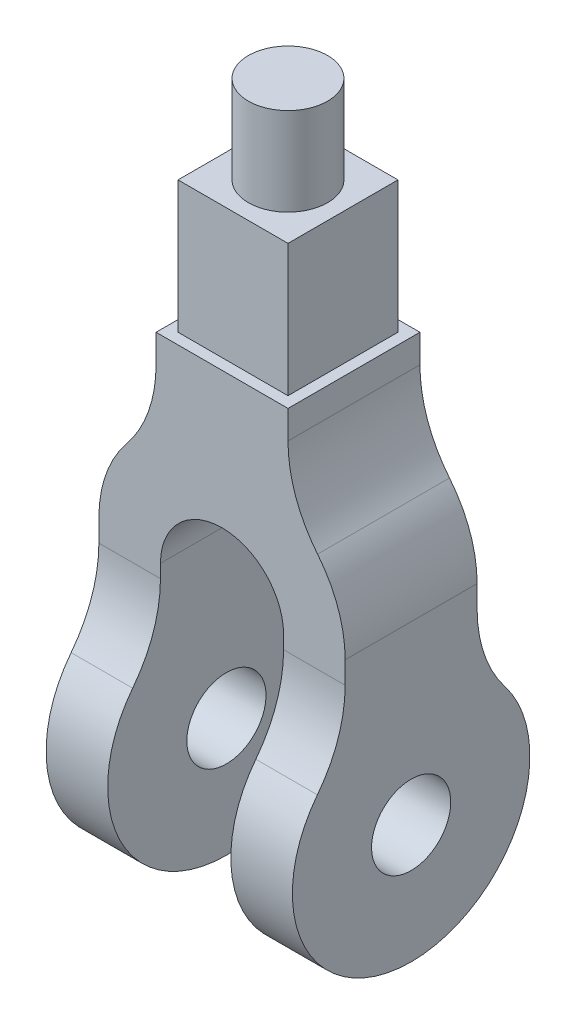
ISO-10303-21;
HEADER;
FILE_DESCRIPTION(('STEP AP214'),'2;1');
FILE_NAME('part.step','',(''),(''),'','','');
FILE_SCHEMA(('AUTOMOTIVE_DESIGN { 1 0 10303 214 1 1 1 1 }'));
ENDSEC;
DATA;
#1=APPLICATION_CONTEXT('core data for automotive mechanical design processes');
#2=APPLICATION_PROTOCOL_DEFINITION('international standard','automotive_design',2000,#1);
#3=PRODUCT_CONTEXT('',#1,'mechanical');
#4=PRODUCT('Part','Part','',(#3));
#5=PRODUCT_RELATED_PRODUCT_CATEGORY('part','',(#4));
#6=PRODUCT_DEFINITION_FORMATION('','',#4);
#7=PRODUCT_DEFINITION_CONTEXT('part definition',#1,'design');
#8=PRODUCT_DEFINITION('design','',#6,#7);
#9=PRODUCT_DEFINITION_SHAPE('','',#8);
#10=(LENGTH_UNIT() NAMED_UNIT(*) SI_UNIT(.MILLI.,.METRE.));
#11=(NAMED_UNIT(*) PLANE_ANGLE_UNIT() SI_UNIT($,.RADIAN.));
#12=(NAMED_UNIT(*) SI_UNIT($,.STERADIAN.) SOLID_ANGLE_UNIT());
#13=UNCERTAINTY_MEASURE_WITH_UNIT(LENGTH_MEASURE(1.E-05),#10,'distance_accuracy_value','');
#14=(GEOMETRIC_REPRESENTATION_CONTEXT(3) GLOBAL_UNCERTAINTY_ASSIGNED_CONTEXT((#13)) GLOBAL_UNIT_ASSIGNED_CONTEXT((#10,
#11,#12)) REPRESENTATION_CONTEXT('',''));
#15=CARTESIAN_POINT('',(0.,0.,0.));
#16=DIRECTION('',(0.,0.,1.));
#17=DIRECTION('',(1.,0.,0.));
#18=AXIS2_PLACEMENT_3D('',#15,#16,#17);
#19=CARTESIAN_POINT('',(-69.3333333333333,42.6666666666667,42.));
#20=DIRECTION('',(0.,0.,1.));
#21=DIRECTION('',(0.,-1.,0.));
#22=AXIS2_PLACEMENT_3D('',#19,#20,#21);
#23=PLANE('',#22);
#24=DIRECTION('',(0.,-1.,0.));
#25=VECTOR('',#24,1.);
#26=CARTESIAN_POINT('',(-22.3333333333333,0.,42.));
#27=LINE('',#26,#25);
#28=CARTESIAN_POINT('',(-22.3333333333333,12.6666666666666,42.));
#29=VERTEX_POINT('',#28);
#30=CARTESIAN_POINT('',(-22.3333333333333,6.25901559373063,42.));
#31=VERTEX_POINT('',#30);
#32=EDGE_CURVE('E426',#29,#31,#27,.T.);
#33=ORIENTED_EDGE('',*,*,#32,.F.);
#34=DIRECTION('',(-1.,0.,0.));
#35=VECTOR('',#34,1.);
#36=CARTESIAN_POINT('',(-69.3333333333333,12.6666666666666,42.));
#37=LINE('',#36,#35);
#38=CARTESIAN_POINT('',(-52.3333333333333,12.6666666666666,42.));
#39=VERTEX_POINT('',#38);
#40=EDGE_CURVE('E62',#29,#39,#37,.T.);
#41=ORIENTED_EDGE('',*,*,#40,.T.);
#42=DIRECTION('',(0.,1.,0.));
#43=VECTOR('',#42,1.);
#44=CARTESIAN_POINT('',(-52.3333333333333,0.,42.));
#45=LINE('',#44,#43);
#46=CARTESIAN_POINT('',(-52.3333333333333,6.25901559373063,42.));
#47=VERTEX_POINT('',#46);
#48=EDGE_CURVE('E348',#47,#39,#45,.T.);
#49=ORIENTED_EDGE('',*,*,#48,.F.);
#50=CARTESIAN_POINT('',(-82.3333333333333,6.25901559373062,42.));
#51=DIRECTION('',(0.,0.,1.));
#52=DIRECTION('',(0.,-1.,0.));
#53=AXIS2_PLACEMENT_3D('',#50,#51,#52);
#54=CIRCLE('',#53,30.);
#55=CARTESIAN_POINT('',(-59.0574712643678,-12.6680614375094,42.));
#56=VERTEX_POINT('',#55);
#57=EDGE_CURVE('E352',#56,#47,#54,.T.);
#58=ORIENTED_EDGE('',*,*,#57,.F.);
#59=CARTESIAN_POINT('',(-37.3333333333333,-30.3333333333334,42.));
#60=DIRECTION('',(0.,0.,1.));
#61=DIRECTION('',(0.,-1.,0.));
#62=AXIS2_PLACEMENT_3D('',#59,#60,#61);
#63=CIRCLE('',#62,28.);
#64=CARTESIAN_POINT('',(-65.3333333333333,-30.3333333333334,42.));
#65=VERTEX_POINT('',#64);
#66=EDGE_CURVE('E356',#65,#56,#63,.F.);
#67=ORIENTED_EDGE('',*,*,#66,.F.);
#68=DIRECTION('',(0.,-1.,0.));
#69=VECTOR('',#68,1.);
#70=CARTESIAN_POINT('',(-65.3333333333333,42.6666666666666,42.));
#71=LINE('',#70,#69);
#72=CARTESIAN_POINT('',(-65.3333333333333,-35.3476219642615,42.));
#73=VERTEX_POINT('',#72);
#74=EDGE_CURVE('E360',#65,#73,#71,.T.);
#75=ORIENTED_EDGE('',*,*,#74,.T.);
#76=DIRECTION('',(1.,0.,0.));
#77=VECTOR('',#76,1.);
#78=CARTESIAN_POINT('',(-69.3333333333333,-35.3476219642615,42.));
#79=LINE('',#78,#77);
#80=CARTESIAN_POINT('',(-51.3333333333333,-35.3476219642615,42.));
#81=VERTEX_POINT('',#80);
#82=EDGE_CURVE('E274',#73,#81,#79,.T.);
#83=ORIENTED_EDGE('',*,*,#82,.T.);
#84=DIRECTION('',(0.,1.,0.));
#85=VECTOR('',#84,1.);
#86=CARTESIAN_POINT('',(-51.3333333333333,0.,42.));
#87=LINE('',#86,#85);
#88=CARTESIAN_POINT('',(-51.3333333333333,-32.3333333333334,42.));
#89=VERTEX_POINT('',#88);
#90=EDGE_CURVE('E345',#81,#89,#87,.T.);
#91=ORIENTED_EDGE('',*,*,#90,.T.);
#92=CARTESIAN_POINT('',(-37.3333333333333,-32.3333333333334,42.));
#93=DIRECTION('',(0.,0.,1.));
#94=DIRECTION('',(0.,-1.,0.));
#95=AXIS2_PLACEMENT_3D('',#92,#93,#94);
#96=CIRCLE('',#95,14.);
#97=CARTESIAN_POINT('',(-23.3333333333333,-32.3333333333334,42.));
#98=VERTEX_POINT('',#97);
#99=EDGE_CURVE('E342',#89,#98,#96,.F.);
#100=ORIENTED_EDGE('',*,*,#99,.T.);
#101=DIRECTION('',(0.,-1.,0.));
#102=VECTOR('',#101,1.);
#103=CARTESIAN_POINT('',(-23.3333333333333,0.,42.));
#104=LINE('',#103,#102);
#105=CARTESIAN_POINT('',(-23.3333333333333,-35.3476219642616,42.));
#106=VERTEX_POINT('',#105);
#107=EDGE_CURVE('E339',#98,#106,#104,.T.);
#108=ORIENTED_EDGE('',*,*,#107,.T.);
#109=CARTESIAN_POINT('',(-9.33333333333331,-35.3476219642616,42.));
#110=VERTEX_POINT('',#109);
#111=EDGE_CURVE('E260',#106,#110,#79,.T.);
#112=ORIENTED_EDGE('',*,*,#111,.T.);
#113=DIRECTION('',(0.,-1.,0.));
#114=VECTOR('',#113,1.);
#115=CARTESIAN_POINT('',(-9.3333333333333,42.6666666666666,42.));
#116=LINE('',#115,#114);
#117=CARTESIAN_POINT('',(-9.33333333333333,-30.3333333333334,42.));
#118=VERTEX_POINT('',#117);
#119=EDGE_CURVE('E277',#118,#110,#116,.T.);
#120=ORIENTED_EDGE('',*,*,#119,.F.);
#121=CARTESIAN_POINT('',(-37.3333333333333,-30.3333333333334,42.));
#122=DIRECTION('',(0.,0.,1.));
#123=DIRECTION('',(0.,-1.,0.));
#124=AXIS2_PLACEMENT_3D('',#121,#122,#123);
#125=CIRCLE('',#124,28.);
#126=CARTESIAN_POINT('',(-15.6091954022988,-12.6680614375094,42.));
#127=VERTEX_POINT('',#126);
#128=EDGE_CURVE('E335',#127,#118,#125,.F.);
#129=ORIENTED_EDGE('',*,*,#128,.F.);
#130=CARTESIAN_POINT('',(7.66666666666668,6.25901559373062,42.));
#131=DIRECTION('',(0.,0.,1.));
#132=DIRECTION('',(0.,-1.,0.));
#133=AXIS2_PLACEMENT_3D('',#130,#131,#132);
#134=CIRCLE('',#133,30.);
#135=EDGE_CURVE('E331',#31,#127,#134,.T.);
#136=ORIENTED_EDGE('',*,*,#135,.F.);
#137=EDGE_LOOP('',(#33,#41,#49,#58,#67,#75,#83,#91,#100,#108,#112,#120,#129,#136));
#138=FACE_BOUND('',#137,.T.);
#139=ADVANCED_FACE('F45',(#138),#23,.T.);
#140=CARTESIAN_POINT('',(-69.3333333333333,42.6666666666667,12.));
#141=DIRECTION('',(0.,0.,-1.));
#142=DIRECTION('',(0.,1.,0.));
#143=AXIS2_PLACEMENT_3D('',#140,#141,#142);
#144=PLANE('',#143);
#145=DIRECTION('',(0.,-1.,0.));
#146=VECTOR('',#145,1.);
#147=CARTESIAN_POINT('',(-52.3333333333333,0.,12.));
#148=LINE('',#147,#146);
#149=CARTESIAN_POINT('',(-52.3333333333333,12.6666666666666,12.));
#150=VERTEX_POINT('',#149);
#151=CARTESIAN_POINT('',(-52.3333333333333,6.25901559373063,12.));
#152=VERTEX_POINT('',#151);
#153=EDGE_CURVE('E317',#150,#152,#148,.T.);
#154=ORIENTED_EDGE('',*,*,#153,.F.);
#155=DIRECTION('',(1.,0.,0.));
#156=VECTOR('',#155,1.);
#157=CARTESIAN_POINT('',(-69.3333333333333,12.6666666666666,12.));
#158=LINE('',#157,#156);
#159=CARTESIAN_POINT('',(-22.3333333333333,12.6666666666666,12.));
#160=VERTEX_POINT('',#159);
#161=EDGE_CURVE('E245',#150,#160,#158,.T.);
#162=ORIENTED_EDGE('',*,*,#161,.T.);
#163=DIRECTION('',(0.,1.,0.));
#164=VECTOR('',#163,1.);
#165=CARTESIAN_POINT('',(-22.3333333333333,0.,12.));
#166=LINE('',#165,#164);
#167=CARTESIAN_POINT('',(-22.3333333333333,6.25901559373063,12.));
#168=VERTEX_POINT('',#167);
#169=EDGE_CURVE('E411',#168,#160,#166,.T.);
#170=ORIENTED_EDGE('',*,*,#169,.F.);
#171=CARTESIAN_POINT('',(7.66666666666668,6.25901559373062,12.));
#172=DIRECTION('',(0.,0.,-1.));
#173=DIRECTION('',(0.,1.,0.));
#174=AXIS2_PLACEMENT_3D('',#171,#172,#173);
#175=CIRCLE('',#174,30.);
#176=CARTESIAN_POINT('',(-15.6091954022988,-12.6680614375094,12.));
#177=VERTEX_POINT('',#176);
#178=EDGE_CURVE('E300',#177,#168,#175,.T.);
#179=ORIENTED_EDGE('',*,*,#178,.F.);
#180=CARTESIAN_POINT('',(-37.3333333333333,-30.3333333333334,12.));
#181=DIRECTION('',(0.,0.,-1.));
#182=DIRECTION('',(0.,1.,0.));
#183=AXIS2_PLACEMENT_3D('',#180,#181,#182);
#184=CIRCLE('',#183,28.);
#185=CARTESIAN_POINT('',(-9.33333333333333,-30.3333333333334,12.));
#186=VERTEX_POINT('',#185);
#187=EDGE_CURVE('E304',#186,#177,#184,.F.);
#188=ORIENTED_EDGE('',*,*,#187,.F.);
#189=DIRECTION('',(0.,1.,0.));
#190=VECTOR('',#189,1.);
#191=CARTESIAN_POINT('',(-9.3333333333333,42.6666666666666,12.));
#192=LINE('',#191,#190);
#193=CARTESIAN_POINT('',(-9.33333333333331,-35.3476219642616,12.));
#194=VERTEX_POINT('',#193);
#195=EDGE_CURVE('E281',#194,#186,#192,.T.);
#196=ORIENTED_EDGE('',*,*,#195,.F.);
#197=DIRECTION('',(1.,0.,0.));
#198=VECTOR('',#197,1.);
#199=CARTESIAN_POINT('',(-69.3333333333333,-35.3476219642615,12.));
#200=LINE('',#199,#198);
#201=CARTESIAN_POINT('',(-23.3333333333333,-35.3476219642616,12.));
#202=VERTEX_POINT('',#201);
#203=EDGE_CURVE('E271',#202,#194,#200,.T.);
#204=ORIENTED_EDGE('',*,*,#203,.F.);
#205=DIRECTION('',(0.,1.,0.));
#206=VECTOR('',#205,1.);
#207=CARTESIAN_POINT('',(-23.3333333333333,0.,12.));
#208=LINE('',#207,#206);
#209=CARTESIAN_POINT('',(-23.3333333333333,-32.3333333333334,12.));
#210=VERTEX_POINT('',#209);
#211=EDGE_CURVE('E308',#202,#210,#208,.T.);
#212=ORIENTED_EDGE('',*,*,#211,.T.);
#213=CARTESIAN_POINT('',(-37.3333333333333,-32.3333333333334,12.));
#214=DIRECTION('',(0.,0.,-1.));
#215=DIRECTION('',(0.,1.,0.));
#216=AXIS2_PLACEMENT_3D('',#213,#214,#215);
#217=CIRCLE('',#216,14.);
#218=CARTESIAN_POINT('',(-51.3333333333333,-32.3333333333334,12.));
#219=VERTEX_POINT('',#218);
#220=EDGE_CURVE('E311',#210,#219,#217,.F.);
#221=ORIENTED_EDGE('',*,*,#220,.T.);
#222=DIRECTION('',(0.,-1.,0.));
#223=VECTOR('',#222,1.);
#224=CARTESIAN_POINT('',(-51.3333333333333,0.,12.));
#225=LINE('',#224,#223);
#226=CARTESIAN_POINT('',(-51.3333333333333,-35.3476219642615,12.));
#227=VERTEX_POINT('',#226);
#228=EDGE_CURVE('E314',#219,#227,#225,.T.);
#229=ORIENTED_EDGE('',*,*,#228,.T.);
#230=CARTESIAN_POINT('',(-65.3333333333333,-35.3476219642615,12.));
#231=VERTEX_POINT('',#230);
#232=EDGE_CURVE('E270',#231,#227,#200,.T.);
#233=ORIENTED_EDGE('',*,*,#232,.F.);
#234=DIRECTION('',(0.,1.,0.));
#235=VECTOR('',#234,1.);
#236=CARTESIAN_POINT('',(-65.3333333333333,42.6666666666666,12.));
#237=LINE('',#236,#235);
#238=CARTESIAN_POINT('',(-65.3333333333333,-30.3333333333334,12.));
#239=VERTEX_POINT('',#238);
#240=EDGE_CURVE('E328',#231,#239,#237,.T.);
#241=ORIENTED_EDGE('',*,*,#240,.T.);
#242=CARTESIAN_POINT('',(-37.3333333333333,-30.3333333333334,12.));
#243=DIRECTION('',(0.,0.,-1.));
#244=DIRECTION('',(0.,1.,0.));
#245=AXIS2_PLACEMENT_3D('',#242,#243,#244);
#246=CIRCLE('',#245,28.);
#247=CARTESIAN_POINT('',(-59.0574712643678,-12.6680614375094,12.));
#248=VERTEX_POINT('',#247);
#249=EDGE_CURVE('E324',#248,#239,#246,.F.);
#250=ORIENTED_EDGE('',*,*,#249,.F.);
#251=CARTESIAN_POINT('',(-82.3333333333333,6.25901559373062,12.));
#252=DIRECTION('',(0.,0.,-1.));
#253=DIRECTION('',(0.,1.,0.));
#254=AXIS2_PLACEMENT_3D('',#251,#252,#253);
#255=CIRCLE('',#254,30.);
#256=EDGE_CURVE('E320',#152,#248,#255,.T.);
#257=ORIENTED_EDGE('',*,*,#256,.F.);
#258=EDGE_LOOP('',(#154,#162,#170,#179,#188,#196,#204,#212,#221,#229,#233,#241,#250,#257));
#259=FACE_BOUND('',#258,.T.);
#260=ADVANCED_FACE('F456',(#259),#144,.T.);
#261=CARTESIAN_POINT('',(-52.3333333333333,0.,0.));
#262=DIRECTION('',(-1.,0.,0.));
#263=DIRECTION('',(0.,-1.,0.));
#264=AXIS2_PLACEMENT_3D('',#261,#262,#263);
#265=PLANE('',#264);
#266=ORIENTED_EDGE('',*,*,#48,.T.);
#267=DIRECTION('',(0.,0.,-1.));
#268=VECTOR('',#267,1.);
#269=CARTESIAN_POINT('',(-52.3333333333333,12.6666666666666,0.));
#270=LINE('',#269,#268);
#271=EDGE_CURVE('E256',#39,#150,#270,.T.);
#272=ORIENTED_EDGE('',*,*,#271,.T.);
#273=ORIENTED_EDGE('',*,*,#153,.T.);
#274=DIRECTION('',(0.,0.,1.));
#275=VECTOR('',#274,1.);
#276=CARTESIAN_POINT('',(-52.3333333333333,6.25901559373063,0.));
#277=LINE('',#276,#275);
#278=EDGE_CURVE('E416',#152,#47,#277,.T.);
#279=ORIENTED_EDGE('',*,*,#278,.T.);
#280=EDGE_LOOP('',(#266,#272,#273,#279));
#281=FACE_BOUND('',#280,.T.);
#282=ADVANCED_FACE('F517',(#281),#265,.T.);
#283=CARTESIAN_POINT('',(-22.3333333333333,0.,0.));
#284=DIRECTION('',(1.,0.,0.));
#285=DIRECTION('',(0.,-1.,0.));
#286=AXIS2_PLACEMENT_3D('',#283,#284,#285);
#287=PLANE('',#286);
#288=ORIENTED_EDGE('',*,*,#169,.T.);
#289=DIRECTION('',(0.,0.,1.));
#290=VECTOR('',#289,1.);
#291=CARTESIAN_POINT('',(-22.3333333333333,12.6666666666666,0.));
#292=LINE('',#291,#290);
#293=EDGE_CURVE('E49',#160,#29,#292,.T.);
#294=ORIENTED_EDGE('',*,*,#293,.T.);
#295=ORIENTED_EDGE('',*,*,#32,.T.);
#296=DIRECTION('',(0.,0.,1.));
#297=VECTOR('',#296,1.);
#298=CARTESIAN_POINT('',(-22.3333333333333,6.25901559373063,0.));
#299=LINE('',#298,#297);
#300=EDGE_CURVE('E400',#168,#31,#299,.T.);
#301=ORIENTED_EDGE('',*,*,#300,.F.);
#302=EDGE_LOOP('',(#288,#294,#295,#301));
#303=FACE_BOUND('',#302,.T.);
#304=ADVANCED_FACE('F447',(#303),#287,.T.);
#305=CARTESIAN_POINT('',(-51.3333333333333,0.,0.));
#306=DIRECTION('',(-1.,0.,0.));
#307=DIRECTION('',(0.,0.,1.));
#308=AXIS2_PLACEMENT_3D('',#305,#306,#307);
#309=PLANE('',#308);
#310=CARTESIAN_POINT('',(-51.3333333333333,-70.3333333333334,27.));
#311=DIRECTION('',(-1.,0.,0.));
#312=DIRECTION('',(0.,0.,1.));
#313=AXIS2_PLACEMENT_3D('',#310,#311,#312);
#314=CIRCLE('',#313,9.);
#315=CARTESIAN_POINT('',(-51.3333333333333,-70.3333333333334,36.));
#316=VERTEX_POINT('',#315);
#317=EDGE_CURVE('E364',#316,#316,#314,.T.);
#318=ORIENTED_EDGE('',*,*,#317,.T.);
#319=EDGE_LOOP('',(#318));
#320=FACE_BOUND('',#319,.T.);
#321=ORIENTED_EDGE('',*,*,#90,.F.);
#322=CARTESIAN_POINT('',(-51.3333333333333,-35.3476219642616,72.));
#323=DIRECTION('',(-1.,0.,0.));
#324=DIRECTION('',(0.,0.,1.));
#325=AXIS2_PLACEMENT_3D('',#322,#323,#324);
#326=CIRCLE('',#325,30.);
#327=CARTESIAN_POINT('',(-51.3333333333333,-53.761154263773,48.3157894736842));
#328=VERTEX_POINT('',#327);
#329=EDGE_CURVE('E384',#328,#81,#326,.F.);
#330=ORIENTED_EDGE('',*,*,#329,.F.);
#331=CARTESIAN_POINT('',(-51.3333333333333,-70.3333333333334,27.));
#332=DIRECTION('',(-1.,0.,0.));
#333=DIRECTION('',(0.,0.,1.));
#334=AXIS2_PLACEMENT_3D('',#331,#332,#333);
#335=CIRCLE('',#334,27.);
#336=CARTESIAN_POINT('',(-51.3333333333333,-53.761154263773,5.68421052631579));
#337=VERTEX_POINT('',#336);
#338=EDGE_CURVE('E372',#337,#328,#335,.T.);
#339=ORIENTED_EDGE('',*,*,#338,.F.);
#340=CARTESIAN_POINT('',(-51.3333333333333,-35.3476219642616,-18.));
#341=DIRECTION('',(-1.,0.,0.));
#342=DIRECTION('',(0.,0.,1.));
#343=AXIS2_PLACEMENT_3D('',#340,#341,#342);
#344=CIRCLE('',#343,30.);
#345=EDGE_CURVE('E378',#227,#337,#344,.F.);
#346=ORIENTED_EDGE('',*,*,#345,.F.);
#347=ORIENTED_EDGE('',*,*,#228,.F.);
#348=DIRECTION('',(0.,0.,1.));
#349=VECTOR('',#348,1.);
#350=CARTESIAN_POINT('',(-51.3333333333333,-32.3333333333334,0.));
#351=LINE('',#350,#349);
#352=EDGE_CURVE('E395',#219,#89,#351,.T.);
#353=ORIENTED_EDGE('',*,*,#352,.T.);
#354=EDGE_LOOP('',(#321,#330,#339,#346,#347,#353));
#355=FACE_BOUND('',#354,.T.);
#356=ADVANCED_FACE('F483',(#320,#355),#309,.F.);
#357=CARTESIAN_POINT('',(-37.3333333333333,-32.3333333333334,0.));
#358=DIRECTION('',(0.,0.,1.));
#359=DIRECTION('',(1.,0.,0.));
#360=AXIS2_PLACEMENT_3D('',#357,#358,#359);
#361=CYLINDRICAL_SURFACE('',#360,14.);
#362=ORIENTED_EDGE('',*,*,#99,.F.);
#363=ORIENTED_EDGE('',*,*,#352,.F.);
#364=ORIENTED_EDGE('',*,*,#220,.F.);
#365=DIRECTION('',(0.,0.,1.));
#366=VECTOR('',#365,1.);
#367=CARTESIAN_POINT('',(-23.3333333333333,-32.3333333333334,0.));
#368=LINE('',#367,#366);
#369=EDGE_CURVE('E390',#210,#98,#368,.T.);
#370=ORIENTED_EDGE('',*,*,#369,.T.);
#371=EDGE_LOOP('',(#362,#363,#364,#370));
#372=FACE_BOUND('',#371,.T.);
#373=ADVANCED_FACE('F475',(#372),#361,.F.);
#374=CARTESIAN_POINT('',(-23.3333333333333,0.,0.));
#375=DIRECTION('',(1.,0.,0.));
#376=DIRECTION('',(0.,0.,1.));
#377=AXIS2_PLACEMENT_3D('',#374,#375,#376);
#378=PLANE('',#377);
#379=CARTESIAN_POINT('',(-23.3333333333333,-70.3333333333334,27.));
#380=DIRECTION('',(1.,0.,0.));
#381=DIRECTION('',(0.,0.,-1.));
#382=AXIS2_PLACEMENT_3D('',#379,#380,#381);
#383=CIRCLE('',#382,9.);
#384=CARTESIAN_POINT('',(-23.3333333333333,-70.3333333333334,18.));
#385=VERTEX_POINT('',#384);
#386=EDGE_CURVE('E363',#385,#385,#383,.T.);
#387=ORIENTED_EDGE('',*,*,#386,.T.);
#388=EDGE_LOOP('',(#387));
#389=FACE_BOUND('',#388,.T.);
#390=ORIENTED_EDGE('',*,*,#107,.F.);
#391=ORIENTED_EDGE('',*,*,#369,.F.);
#392=ORIENTED_EDGE('',*,*,#211,.F.);
#393=CARTESIAN_POINT('',(-23.3333333333333,-35.3476219642616,-18.));
#394=DIRECTION('',(1.,0.,0.));
#395=DIRECTION('',(0.,0.,-1.));
#396=AXIS2_PLACEMENT_3D('',#393,#394,#395);
#397=CIRCLE('',#396,30.);
#398=CARTESIAN_POINT('',(-23.3333333333333,-53.761154263773,5.68421052631579));
#399=VERTEX_POINT('',#398);
#400=EDGE_CURVE('E435',#399,#202,#397,.F.);
#401=ORIENTED_EDGE('',*,*,#400,.F.);
#402=CARTESIAN_POINT('',(-23.3333333333333,-70.3333333333334,27.));
#403=DIRECTION('',(1.,0.,0.));
#404=DIRECTION('',(0.,0.,-1.));
#405=AXIS2_PLACEMENT_3D('',#402,#403,#404);
#406=CIRCLE('',#405,27.);
#407=CARTESIAN_POINT('',(-23.3333333333333,-53.761154263773,48.3157894736842));
#408=VERTEX_POINT('',#407);
#409=EDGE_CURVE('E429',#408,#399,#406,.T.);
#410=ORIENTED_EDGE('',*,*,#409,.F.);
#411=CARTESIAN_POINT('',(-23.3333333333333,-35.3476219642616,72.));
#412=DIRECTION('',(1.,0.,0.));
#413=DIRECTION('',(0.,0.,-1.));
#414=AXIS2_PLACEMENT_3D('',#411,#412,#413);
#415=CIRCLE('',#414,30.);
#416=EDGE_CURVE('E437',#106,#408,#415,.F.);
#417=ORIENTED_EDGE('',*,*,#416,.F.);
#418=EDGE_LOOP('',(#390,#391,#392,#401,#410,#417));
#419=FACE_BOUND('',#418,.T.);
#420=ADVANCED_FACE('F472',(#389,#419),#378,.F.);
#421=CARTESIAN_POINT('',(-69.3333333333333,-35.3476219642616,72.));
#422=DIRECTION('',(1.,0.,0.));
#423=DIRECTION('',(0.,1.,0.));
#424=AXIS2_PLACEMENT_3D('',#421,#422,#423);
#425=CYLINDRICAL_SURFACE('',#424,30.);
#426=CARTESIAN_POINT('',(-65.3333333333333,-35.3476219642616,72.));
#427=DIRECTION('',(1.,0.,0.));
#428=DIRECTION('',(0.,1.,0.));
#429=AXIS2_PLACEMENT_3D('',#426,#427,#428);
#430=CIRCLE('',#429,30.);
#431=CARTESIAN_POINT('',(-65.3333333333333,-53.761154263773,48.3157894736842));
#432=VERTEX_POINT('',#431);
#433=EDGE_CURVE('E387',#73,#432,#430,.F.);
#434=ORIENTED_EDGE('',*,*,#433,.T.);
#435=DIRECTION('',(1.,0.,0.));
#436=VECTOR('',#435,1.);
#437=CARTESIAN_POINT('',(-69.3333333333333,-53.761154263773,48.3157894736842));
#438=LINE('',#437,#436);
#439=EDGE_CURVE('E264',#432,#328,#438,.T.);
#440=ORIENTED_EDGE('',*,*,#439,.T.);
#441=ORIENTED_EDGE('',*,*,#329,.T.);
#442=ORIENTED_EDGE('',*,*,#82,.F.);
#443=EDGE_LOOP('',(#434,#440,#441,#442));
#444=FACE_BOUND('',#443,.T.);
#445=ADVANCED_FACE('F505',(#444),#425,.F.);
#446=ORIENTED_EDGE('',*,*,#416,.T.);
#447=CARTESIAN_POINT('',(-9.33333333333331,-53.761154263773,48.3157894736842));
#448=VERTEX_POINT('',#447);
#449=EDGE_CURVE('E261',#408,#448,#438,.T.);
#450=ORIENTED_EDGE('',*,*,#449,.T.);
#451=CARTESIAN_POINT('',(-9.33333333333331,-35.3476219642616,72.));
#452=DIRECTION('',(-1.,0.,0.));
#453=DIRECTION('',(0.,1.,0.));
#454=AXIS2_PLACEMENT_3D('',#451,#452,#453);
#455=CIRCLE('',#454,30.);
#456=EDGE_CURVE('E292',#110,#448,#455,.T.);
#457=ORIENTED_EDGE('',*,*,#456,.F.);
#458=ORIENTED_EDGE('',*,*,#111,.F.);
#459=EDGE_LOOP('',(#446,#450,#457,#458));
#460=FACE_BOUND('',#459,.T.);
#461=ADVANCED_FACE('F756',(#460),#425,.F.);
#462=CARTESIAN_POINT('',(-69.3333333333333,-35.3476219642616,-18.));
#463=DIRECTION('',(1.,0.,0.));
#464=DIRECTION('',(0.,1.,0.));
#465=AXIS2_PLACEMENT_3D('',#462,#463,#464);
#466=CYLINDRICAL_SURFACE('',#465,30.);
#467=CARTESIAN_POINT('',(-65.3333333333333,-35.3476219642616,-18.));
#468=DIRECTION('',(1.,0.,0.));
#469=DIRECTION('',(0.,1.,0.));
#470=AXIS2_PLACEMENT_3D('',#467,#468,#469);
#471=CIRCLE('',#470,30.);
#472=CARTESIAN_POINT('',(-65.3333333333333,-53.761154263773,5.68421052631579));
#473=VERTEX_POINT('',#472);
#474=EDGE_CURVE('E381',#473,#231,#471,.F.);
#475=ORIENTED_EDGE('',*,*,#474,.T.);
#476=ORIENTED_EDGE('',*,*,#232,.T.);
#477=ORIENTED_EDGE('',*,*,#345,.T.);
#478=DIRECTION('',(1.,0.,0.));
#479=VECTOR('',#478,1.);
#480=CARTESIAN_POINT('',(-69.3333333333333,-53.761154263773,5.68421052631579));
#481=LINE('',#480,#479);
#482=EDGE_CURVE('E265',#473,#337,#481,.T.);
#483=ORIENTED_EDGE('',*,*,#482,.F.);
#484=EDGE_LOOP('',(#475,#476,#477,#483));
#485=FACE_BOUND('',#484,.T.);
#486=ADVANCED_FACE('F489',(#485),#466,.F.);
#487=ORIENTED_EDGE('',*,*,#400,.T.);
#488=ORIENTED_EDGE('',*,*,#203,.T.);
#489=CARTESIAN_POINT('',(-9.33333333333331,-35.3476219642616,-18.));
#490=DIRECTION('',(-1.,0.,0.));
#491=DIRECTION('',(0.,-1.,0.));
#492=AXIS2_PLACEMENT_3D('',#489,#490,#491);
#493=CIRCLE('',#492,30.);
#494=CARTESIAN_POINT('',(-9.33333333333331,-53.761154263773,5.68421052631579));
#495=VERTEX_POINT('',#494);
#496=EDGE_CURVE('E285',#495,#194,#493,.T.);
#497=ORIENTED_EDGE('',*,*,#496,.F.);
#498=EDGE_CURVE('E266',#399,#495,#481,.T.);
#499=ORIENTED_EDGE('',*,*,#498,.F.);
#500=EDGE_LOOP('',(#487,#488,#497,#499));
#501=FACE_BOUND('',#500,.T.);
#502=ADVANCED_FACE('F739',(#501),#466,.F.);
#503=CARTESIAN_POINT('',(-69.3333333333333,-70.3333333333334,27.));
#504=DIRECTION('',(1.,0.,0.));
#505=DIRECTION('',(0.,1.,0.));
#506=AXIS2_PLACEMENT_3D('',#503,#504,#505);
#507=CYLINDRICAL_SURFACE('',#506,27.);
#508=CARTESIAN_POINT('',(-65.3333333333333,-70.3333333333334,27.));
#509=DIRECTION('',(1.,0.,0.));
#510=DIRECTION('',(0.,1.,0.));
#511=AXIS2_PLACEMENT_3D('',#508,#509,#510);
#512=CIRCLE('',#511,27.);
#513=EDGE_CURVE('E375',#432,#473,#512,.T.);
#514=ORIENTED_EDGE('',*,*,#513,.T.);
#515=ORIENTED_EDGE('',*,*,#482,.T.);
#516=ORIENTED_EDGE('',*,*,#338,.T.);
#517=ORIENTED_EDGE('',*,*,#439,.F.);
#518=EDGE_LOOP('',(#514,#515,#516,#517));
#519=FACE_BOUND('',#518,.T.);
#520=ADVANCED_FACE('F492',(#519),#507,.T.);
#521=ORIENTED_EDGE('',*,*,#449,.F.);
#522=ORIENTED_EDGE('',*,*,#409,.T.);
#523=ORIENTED_EDGE('',*,*,#498,.T.);
#524=CARTESIAN_POINT('',(-9.33333333333331,-70.3333333333334,27.));
#525=DIRECTION('',(1.,0.,0.));
#526=DIRECTION('',(0.,1.,0.));
#527=AXIS2_PLACEMENT_3D('',#524,#525,#526);
#528=CIRCLE('',#527,27.);
#529=EDGE_CURVE('E289',#448,#495,#528,.T.);
#530=ORIENTED_EDGE('',*,*,#529,.F.);
#531=EDGE_LOOP('',(#521,#522,#523,#530));
#532=FACE_BOUND('',#531,.T.);
#533=ADVANCED_FACE('F719',(#532),#507,.T.);
#534=CARTESIAN_POINT('',(-69.3333333333333,-70.3333333333334,27.));
#535=DIRECTION('',(1.,0.,0.));
#536=DIRECTION('',(0.,1.,0.));
#537=AXIS2_PLACEMENT_3D('',#534,#535,#536);
#538=CYLINDRICAL_SURFACE('',#537,9.);
#539=CARTESIAN_POINT('',(-9.33333333333331,-70.3333333333334,27.));
#540=DIRECTION('',(1.,0.,0.));
#541=DIRECTION('',(0.,1.,0.));
#542=AXIS2_PLACEMENT_3D('',#539,#540,#541);
#543=CIRCLE('',#542,9.);
#544=CARTESIAN_POINT('',(-9.33333333333331,-61.3333333333334,27.));
#545=VERTEX_POINT('',#544);
#546=EDGE_CURVE('E296',#545,#545,#543,.T.);
#547=ORIENTED_EDGE('',*,*,#546,.T.);
#548=EDGE_LOOP('',(#547));
#549=FACE_BOUND('',#548,.T.);
#550=ORIENTED_EDGE('',*,*,#386,.F.);
#551=EDGE_LOOP('',(#550));
#552=FACE_BOUND('',#551,.T.);
#553=ADVANCED_FACE('F539',(#549,#552),#538,.F.);
#554=ORIENTED_EDGE('',*,*,#317,.F.);
#555=EDGE_LOOP('',(#554));
#556=FACE_BOUND('',#555,.T.);
#557=CARTESIAN_POINT('',(-65.3333333333333,-70.3333333333334,27.));
#558=DIRECTION('',(1.,0.,0.));
#559=DIRECTION('',(0.,1.,0.));
#560=AXIS2_PLACEMENT_3D('',#557,#558,#559);
#561=CIRCLE('',#560,9.);
#562=CARTESIAN_POINT('',(-65.3333333333333,-61.3333333333334,27.));
#563=VERTEX_POINT('',#562);
#564=EDGE_CURVE('E368',#563,#563,#561,.T.);
#565=ORIENTED_EDGE('',*,*,#564,.F.);
#566=EDGE_LOOP('',(#565));
#567=FACE_BOUND('',#566,.T.);
#568=ADVANCED_FACE('F536',(#556,#567),#538,.F.);
#569=CARTESIAN_POINT('',(-37.3333333333333,-30.3333333333334,0.));
#570=DIRECTION('',(0.,0.,1.));
#571=DIRECTION('',(1.,0.,0.));
#572=AXIS2_PLACEMENT_3D('',#569,#570,#571);
#573=CYLINDRICAL_SURFACE('',#572,28.);
#574=DIRECTION('',(0.,0.,1.));
#575=VECTOR('',#574,1.);
#576=CARTESIAN_POINT('',(-65.3333333333333,-30.3333333333334,0.));
#577=LINE('',#576,#575);
#578=EDGE_CURVE('E412',#239,#65,#577,.T.);
#579=ORIENTED_EDGE('',*,*,#578,.T.);
#580=ORIENTED_EDGE('',*,*,#66,.T.);
#581=DIRECTION('',(0.,0.,1.));
#582=VECTOR('',#581,1.);
#583=CARTESIAN_POINT('',(-59.0574712643678,-12.6680614375094,0.));
#584=LINE('',#583,#582);
#585=EDGE_CURVE('E407',#248,#56,#584,.T.);
#586=ORIENTED_EDGE('',*,*,#585,.F.);
#587=ORIENTED_EDGE('',*,*,#249,.T.);
#588=EDGE_LOOP('',(#579,#580,#586,#587));
#589=FACE_BOUND('',#588,.T.);
#590=ADVANCED_FACE('F512',(#589),#573,.T.);
#591=CARTESIAN_POINT('',(-82.3333333333333,6.25901559373062,0.));
#592=DIRECTION('',(0.,0.,1.));
#593=DIRECTION('',(1.,0.,0.));
#594=AXIS2_PLACEMENT_3D('',#591,#592,#593);
#595=CYLINDRICAL_SURFACE('',#594,30.);
#596=ORIENTED_EDGE('',*,*,#585,.T.);
#597=ORIENTED_EDGE('',*,*,#57,.T.);
#598=ORIENTED_EDGE('',*,*,#278,.F.);
#599=ORIENTED_EDGE('',*,*,#256,.T.);
#600=EDGE_LOOP('',(#596,#597,#598,#599));
#601=FACE_BOUND('',#600,.T.);
#602=ADVANCED_FACE('F514',(#601),#595,.F.);
#603=CARTESIAN_POINT('',(-37.3333333333333,-30.3333333333334,0.));
#604=DIRECTION('',(0.,0.,1.));
#605=DIRECTION('',(-1.,0.,0.));
#606=AXIS2_PLACEMENT_3D('',#603,#604,#605);
#607=CYLINDRICAL_SURFACE('',#606,28.);
#608=DIRECTION('',(0.,0.,1.));
#609=VECTOR('',#608,1.);
#610=CARTESIAN_POINT('',(-15.6091954022988,-12.6680614375094,0.));
#611=LINE('',#610,#609);
#612=EDGE_CURVE('E391',#177,#127,#611,.T.);
#613=ORIENTED_EDGE('',*,*,#612,.T.);
#614=ORIENTED_EDGE('',*,*,#128,.T.);
#615=DIRECTION('',(0.,0.,1.));
#616=VECTOR('',#615,1.);
#617=CARTESIAN_POINT('',(-9.3333333333333,-30.3333333333334,0.));
#618=LINE('',#617,#616);
#619=EDGE_CURVE('E396',#186,#118,#618,.T.);
#620=ORIENTED_EDGE('',*,*,#619,.F.);
#621=ORIENTED_EDGE('',*,*,#187,.T.);
#622=EDGE_LOOP('',(#613,#614,#620,#621));
#623=FACE_BOUND('',#622,.T.);
#624=ADVANCED_FACE('F460',(#623),#607,.T.);
#625=CARTESIAN_POINT('',(7.66666666666668,6.25901559373062,0.));
#626=DIRECTION('',(0.,0.,1.));
#627=DIRECTION('',(-1.,0.,0.));
#628=AXIS2_PLACEMENT_3D('',#625,#626,#627);
#629=CYLINDRICAL_SURFACE('',#628,30.);
#630=ORIENTED_EDGE('',*,*,#300,.T.);
#631=ORIENTED_EDGE('',*,*,#135,.T.);
#632=ORIENTED_EDGE('',*,*,#612,.F.);
#633=ORIENTED_EDGE('',*,*,#178,.T.);
#634=EDGE_LOOP('',(#630,#631,#632,#633));
#635=FACE_BOUND('',#634,.T.);
#636=ADVANCED_FACE('F453',(#635),#629,.F.);
#637=CARTESIAN_POINT('',(-9.3333333333333,42.6666666666666,54.));
#638=DIRECTION('',(-1.,0.,0.));
#639=DIRECTION('',(0.,1.,0.));
#640=AXIS2_PLACEMENT_3D('',#637,#638,#639);
#641=PLANE('',#640);
#642=ORIENTED_EDGE('',*,*,#546,.F.);
#643=EDGE_LOOP('',(#642));
#644=FACE_BOUND('',#643,.T.);
#645=ORIENTED_EDGE('',*,*,#119,.T.);
#646=ORIENTED_EDGE('',*,*,#456,.T.);
#647=ORIENTED_EDGE('',*,*,#529,.T.);
#648=ORIENTED_EDGE('',*,*,#496,.T.);
#649=ORIENTED_EDGE('',*,*,#195,.T.);
#650=ORIENTED_EDGE('',*,*,#619,.T.);
#651=EDGE_LOOP('',(#645,#646,#647,#648,#649,#650));
#652=FACE_BOUND('',#651,.T.);
#653=ADVANCED_FACE('F462',(#644,#652),#641,.F.);
#654=CARTESIAN_POINT('',(-65.3333333333333,42.6666666666666,54.));
#655=DIRECTION('',(1.,0.,0.));
#656=DIRECTION('',(0.,1.,0.));
#657=AXIS2_PLACEMENT_3D('',#654,#655,#656);
#658=PLANE('',#657);
#659=ORIENTED_EDGE('',*,*,#564,.T.);
#660=EDGE_LOOP('',(#659));
#661=FACE_BOUND('',#660,.T.);
#662=ORIENTED_EDGE('',*,*,#74,.F.);
#663=ORIENTED_EDGE('',*,*,#578,.F.);
#664=ORIENTED_EDGE('',*,*,#240,.F.);
#665=ORIENTED_EDGE('',*,*,#474,.F.);
#666=ORIENTED_EDGE('',*,*,#513,.F.);
#667=ORIENTED_EDGE('',*,*,#433,.F.);
#668=EDGE_LOOP('',(#662,#663,#664,#665,#666,#667));
#669=FACE_BOUND('',#668,.T.);
#670=ADVANCED_FACE('F47',(#661,#669),#658,.F.);
#671=CARTESIAN_POINT('',(-37.3333333333333,12.6666666666666,27.));
#672=DIRECTION('',(0.,1.,0.));
#673=DIRECTION('',(0.,0.,1.));
#674=AXIS2_PLACEMENT_3D('',#671,#672,#673);
#675=PLANE('',#674);
#676=ORIENTED_EDGE('',*,*,#40,.F.);
#677=ORIENTED_EDGE('',*,*,#293,.F.);
#678=ORIENTED_EDGE('',*,*,#161,.F.);
#679=ORIENTED_EDGE('',*,*,#271,.F.);
#680=EDGE_LOOP('',(#676,#677,#678,#679));
#681=FACE_BOUND('',#680,.T.);
#682=DIRECTION('',(1.,0.,0.));
#683=VECTOR('',#682,1.);
#684=CARTESIAN_POINT('',(-49.8333333333333,12.6666666666666,39.5));
#685=LINE('',#684,#683);
#686=CARTESIAN_POINT('',(-49.8333333333333,12.6666666666666,39.5));
#687=VERTEX_POINT('',#686);
#688=CARTESIAN_POINT('',(-24.8333333333333,12.6666666666666,39.5));
#689=VERTEX_POINT('',#688);
#690=EDGE_CURVE('E209',#687,#689,#685,.T.);
#691=ORIENTED_EDGE('',*,*,#690,.F.);
#692=DIRECTION('',(0.,0.,1.));
#693=VECTOR('',#692,1.);
#694=CARTESIAN_POINT('',(-49.8333333333333,12.6666666666666,14.5));
#695=LINE('',#694,#693);
#696=CARTESIAN_POINT('',(-49.8333333333333,12.6666666666666,14.5));
#697=VERTEX_POINT('',#696);
#698=EDGE_CURVE('E218',#697,#687,#695,.T.);
#699=ORIENTED_EDGE('',*,*,#698,.F.);
#700=DIRECTION('',(-1.,0.,0.));
#701=VECTOR('',#700,1.);
#702=CARTESIAN_POINT('',(-49.8333333333333,12.6666666666666,14.5));
#703=LINE('',#702,#701);
#704=CARTESIAN_POINT('',(-24.8333333333333,12.6666666666666,14.5));
#705=VERTEX_POINT('',#704);
#706=EDGE_CURVE('E200',#705,#697,#703,.T.);
#707=ORIENTED_EDGE('',*,*,#706,.F.);
#708=DIRECTION('',(0.,0.,-1.));
#709=VECTOR('',#708,1.);
#710=CARTESIAN_POINT('',(-24.8333333333333,12.6666666666666,14.5));
#711=LINE('',#710,#709);
#712=EDGE_CURVE('E215',#689,#705,#711,.T.);
#713=ORIENTED_EDGE('',*,*,#712,.F.);
#714=EDGE_LOOP('',(#691,#699,#707,#713));
#715=FACE_BOUND('',#714,.T.);
#716=ADVANCED_FACE('F214',(#681,#715),#675,.T.);
#717=CARTESIAN_POINT('',(-24.8333333333333,12.6666666666666,14.5));
#718=DIRECTION('',(1.,0.,0.));
#719=DIRECTION('',(0.,0.,-1.));
#720=AXIS2_PLACEMENT_3D('',#717,#718,#719);
#721=PLANE('',#720);
#722=DIRECTION('',(0.,0.,-1.));
#723=VECTOR('',#722,1.);
#724=CARTESIAN_POINT('',(-24.8333333333333,42.6666666666666,14.5));
#725=LINE('',#724,#723);
#726=CARTESIAN_POINT('',(-24.8333333333333,42.6666666666666,39.5));
#727=VERTEX_POINT('',#726);
#728=CARTESIAN_POINT('',(-24.8333333333333,42.6666666666666,14.5));
#729=VERTEX_POINT('',#728);
#730=EDGE_CURVE('E235',#727,#729,#725,.T.);
#731=ORIENTED_EDGE('',*,*,#730,.F.);
#732=DIRECTION('',(0.,1.,0.));
#733=VECTOR('',#732,1.);
#734=CARTESIAN_POINT('',(-24.8333333333333,12.6666666666666,39.5));
#735=LINE('',#734,#733);
#736=EDGE_CURVE('E222',#689,#727,#735,.T.);
#737=ORIENTED_EDGE('',*,*,#736,.F.);
#738=ORIENTED_EDGE('',*,*,#712,.T.);
#739=DIRECTION('',(0.,1.,0.));
#740=VECTOR('',#739,1.);
#741=CARTESIAN_POINT('',(-24.8333333333333,12.6666666666666,14.5));
#742=LINE('',#741,#740);
#743=EDGE_CURVE('E197',#705,#729,#742,.T.);
#744=ORIENTED_EDGE('',*,*,#743,.T.);
#745=EDGE_LOOP('',(#731,#737,#738,#744));
#746=FACE_BOUND('',#745,.T.);
#747=ADVANCED_FACE('F221',(#746),#721,.T.);
#748=CARTESIAN_POINT('',(-49.8333333333333,12.6666666666666,39.5));
#749=DIRECTION('',(0.,0.,1.));
#750=DIRECTION('',(1.,0.,0.));
#751=AXIS2_PLACEMENT_3D('',#748,#749,#750);
#752=PLANE('',#751);
#753=DIRECTION('',(1.,0.,0.));
#754=VECTOR('',#753,1.);
#755=CARTESIAN_POINT('',(-49.8333333333333,42.6666666666666,39.5));
#756=LINE('',#755,#754);
#757=CARTESIAN_POINT('',(-49.8333333333333,42.6666666666666,39.5));
#758=VERTEX_POINT('',#757);
#759=EDGE_CURVE('E224',#758,#727,#756,.T.);
#760=ORIENTED_EDGE('',*,*,#759,.F.);
#761=DIRECTION('',(0.,1.,0.));
#762=VECTOR('',#761,1.);
#763=CARTESIAN_POINT('',(-49.8333333333333,12.6666666666666,39.5));
#764=LINE('',#763,#762);
#765=EDGE_CURVE('E246',#687,#758,#764,.T.);
#766=ORIENTED_EDGE('',*,*,#765,.F.);
#767=ORIENTED_EDGE('',*,*,#690,.T.);
#768=ORIENTED_EDGE('',*,*,#736,.T.);
#769=EDGE_LOOP('',(#760,#766,#767,#768));
#770=FACE_BOUND('',#769,.T.);
#771=ADVANCED_FACE('F524',(#770),#752,.T.);
#772=CARTESIAN_POINT('',(-49.8333333333333,12.6666666666666,14.5));
#773=DIRECTION('',(-1.,0.,0.));
#774=DIRECTION('',(0.,0.,1.));
#775=AXIS2_PLACEMENT_3D('',#772,#773,#774);
#776=PLANE('',#775);
#777=DIRECTION('',(0.,0.,1.));
#778=VECTOR('',#777,1.);
#779=CARTESIAN_POINT('',(-49.8333333333333,42.6666666666666,14.5));
#780=LINE('',#779,#778);
#781=CARTESIAN_POINT('',(-49.8333333333333,42.6666666666666,14.5));
#782=VERTEX_POINT('',#781);
#783=EDGE_CURVE('E70',#782,#758,#780,.T.);
#784=ORIENTED_EDGE('',*,*,#783,.F.);
#785=DIRECTION('',(0.,1.,0.));
#786=VECTOR('',#785,1.);
#787=CARTESIAN_POINT('',(-49.8333333333333,12.6666666666666,14.5));
#788=LINE('',#787,#786);
#789=EDGE_CURVE('E208',#697,#782,#788,.T.);
#790=ORIENTED_EDGE('',*,*,#789,.F.);
#791=ORIENTED_EDGE('',*,*,#698,.T.);
#792=ORIENTED_EDGE('',*,*,#765,.T.);
#793=EDGE_LOOP('',(#784,#790,#791,#792));
#794=FACE_BOUND('',#793,.T.);
#795=ADVANCED_FACE('F574',(#794),#776,.T.);
#796=CARTESIAN_POINT('',(-49.8333333333333,12.6666666666666,14.5));
#797=DIRECTION('',(0.,0.,-1.));
#798=DIRECTION('',(-1.,0.,0.));
#799=AXIS2_PLACEMENT_3D('',#796,#797,#798);
#800=PLANE('',#799);
#801=DIRECTION('',(-1.,0.,0.));
#802=VECTOR('',#801,1.);
#803=CARTESIAN_POINT('',(-49.8333333333333,42.6666666666666,14.5));
#804=LINE('',#803,#802);
#805=EDGE_CURVE('E202',#729,#782,#804,.T.);
#806=ORIENTED_EDGE('',*,*,#805,.F.);
#807=ORIENTED_EDGE('',*,*,#743,.F.);
#808=ORIENTED_EDGE('',*,*,#706,.T.);
#809=ORIENTED_EDGE('',*,*,#789,.T.);
#810=EDGE_LOOP('',(#806,#807,#808,#809));
#811=FACE_BOUND('',#810,.T.);
#812=ADVANCED_FACE('F199',(#811),#800,.T.);
#813=CARTESIAN_POINT('',(-65.3333333333333,42.6666666666666,54.));
#814=DIRECTION('',(0.,-1.,0.));
#815=DIRECTION('',(0.,0.,-1.));
#816=AXIS2_PLACEMENT_3D('',#813,#814,#815);
#817=PLANE('',#816);
#818=CARTESIAN_POINT('',(-37.3333333333333,42.6666666666666,27.));
#819=DIRECTION('',(0.,1.,0.));
#820=DIRECTION('',(0.,0.,1.));
#821=AXIS2_PLACEMENT_3D('',#818,#819,#820);
#822=CIRCLE('',#821,9.);
#823=CARTESIAN_POINT('',(-37.3333333333333,42.6666666666666,36.));
#824=VERTEX_POINT('',#823);
#825=EDGE_CURVE('E12',#824,#824,#822,.T.);
#826=ORIENTED_EDGE('',*,*,#825,.F.);
#827=EDGE_LOOP('',(#826));
#828=FACE_BOUND('',#827,.T.);
#829=ORIENTED_EDGE('',*,*,#730,.T.);
#830=ORIENTED_EDGE('',*,*,#805,.T.);
#831=ORIENTED_EDGE('',*,*,#783,.T.);
#832=ORIENTED_EDGE('',*,*,#759,.T.);
#833=EDGE_LOOP('',(#829,#830,#831,#832));
#834=FACE_BOUND('',#833,.T.);
#835=ADVANCED_FACE('F563',(#828,#834),#817,.F.);
#836=CARTESIAN_POINT('',(-37.3333333333333,62.6666666666667,27.));
#837=DIRECTION('',(0.,-1.,0.));
#838=DIRECTION('',(0.,0.,-1.));
#839=AXIS2_PLACEMENT_3D('',#836,#837,#838);
#840=CYLINDRICAL_SURFACE('',#839,9.);
#841=CARTESIAN_POINT('',(-37.3333333333333,62.6666666666667,27.));
#842=DIRECTION('',(0.,1.,0.));
#843=DIRECTION('',(0.,0.,1.));
#844=AXIS2_PLACEMENT_3D('',#841,#842,#843);
#845=CIRCLE('',#844,9.);
#846=CARTESIAN_POINT('',(-37.3333333333333,62.6666666666667,36.));
#847=VERTEX_POINT('',#846);
#848=EDGE_CURVE('E238',#847,#847,#845,.T.);
#849=ORIENTED_EDGE('',*,*,#848,.F.);
#850=EDGE_LOOP('',(#849));
#851=FACE_BOUND('',#850,.T.);
#852=ORIENTED_EDGE('',*,*,#825,.T.);
#853=EDGE_LOOP('',(#852));
#854=FACE_BOUND('',#853,.T.);
#855=ADVANCED_FACE('F565',(#851,#854),#840,.T.);
#856=CARTESIAN_POINT('',(-37.3333333333333,62.6666666666667,27.));
#857=DIRECTION('',(0.,1.,0.));
#858=DIRECTION('',(0.,0.,1.));
#859=AXIS2_PLACEMENT_3D('',#856,#857,#858);
#860=PLANE('',#859);
#861=ORIENTED_EDGE('',*,*,#848,.T.);
#862=EDGE_LOOP('',(#861));
#863=FACE_BOUND('',#862,.T.);
#864=ADVANCED_FACE('F571',(#863),#860,.T.);
#865=CLOSED_SHELL('',(#139,#260,#282,#304,#356,#373,#420,#445,#461,#486,#502,#520,#533,#553,
#568,#590,#602,#624,#636,#653,#670,#716,#747,#771,#795,#812,#835,#855,#864));
#866=MANIFOLD_SOLID_BREP('B2',#865);
#867=ADVANCED_BREP_SHAPE_REPRESENTATION('',(#18,#866),#14);
#868=SHAPE_DEFINITION_REPRESENTATION(#9,#867);
ENDSEC;
END-ISO-10303-21;
